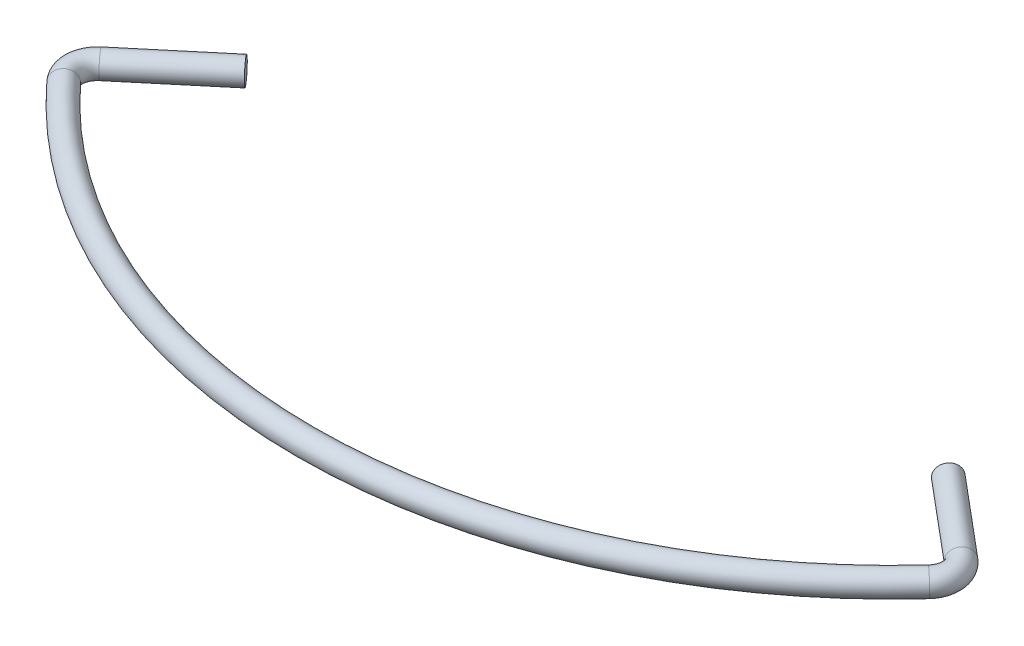
ISO-10303-21;
HEADER;
FILE_DESCRIPTION(('STEP AP214'),'2;1');
FILE_NAME('part.step','',(''),(''),'','','');
FILE_SCHEMA(('AUTOMOTIVE_DESIGN { 1 0 10303 214 1 1 1 1 }'));
ENDSEC;
DATA;
#1=APPLICATION_CONTEXT('core data for automotive mechanical design processes');
#2=APPLICATION_PROTOCOL_DEFINITION('international standard','automotive_design',2000,#1);
#3=PRODUCT_CONTEXT('',#1,'mechanical');
#4=PRODUCT('Part','Part','',(#3));
#5=PRODUCT_RELATED_PRODUCT_CATEGORY('part','',(#4));
#6=PRODUCT_DEFINITION_FORMATION('','',#4);
#7=PRODUCT_DEFINITION_CONTEXT('part definition',#1,'design');
#8=PRODUCT_DEFINITION('design','',#6,#7);
#9=PRODUCT_DEFINITION_SHAPE('','',#8);
#10=(LENGTH_UNIT() NAMED_UNIT(*) SI_UNIT(.MILLI.,.METRE.));
#11=(NAMED_UNIT(*) PLANE_ANGLE_UNIT() SI_UNIT($,.RADIAN.));
#12=(NAMED_UNIT(*) SI_UNIT($,.STERADIAN.) SOLID_ANGLE_UNIT());
#13=UNCERTAINTY_MEASURE_WITH_UNIT(LENGTH_MEASURE(1.E-05),#10,'distance_accuracy_value','');
#14=(GEOMETRIC_REPRESENTATION_CONTEXT(3) GLOBAL_UNCERTAINTY_ASSIGNED_CONTEXT((#13)) GLOBAL_UNIT_ASSIGNED_CONTEXT((#10,
#11,#12)) REPRESENTATION_CONTEXT('',''));
#15=CARTESIAN_POINT('',(0.,0.,0.));
#16=DIRECTION('',(0.,0.,1.));
#17=DIRECTION('',(1.,0.,0.));
#18=AXIS2_PLACEMENT_3D('',#15,#16,#17);
#19=CARTESIAN_POINT('',(517.079999105311,0.,433.881636538413));
#20=DIRECTION('',(0.766044443118981,0.,0.642787609686536));
#21=DIRECTION('',(0.642787609686536,0.,-0.766044443118981));
#22=AXIS2_PLACEMENT_3D('',#19,#20,#21);
#23=CYLINDRICAL_SURFACE('',#22,15.);
#24=CARTESIAN_POINT('',(539.572146309003,0.,452.754788961416));
#25=DIRECTION('',(0.76604444311898,0.,0.642787609686538));
#26=DIRECTION('',(0.642787609686538,0.,-0.76604444311898));
#27=AXIS2_PLACEMENT_3D('',#24,#25,#26);
#28=CIRCLE('',#27,15.);
#29=CARTESIAN_POINT('',(549.213960454303,0.,441.264122314629));
#30=VERTEX_POINT('',#29);
#31=EDGE_CURVE('E47',#30,#30,#28,.T.);
#32=ORIENTED_EDGE('',*,*,#31,.F.);
#33=EDGE_LOOP('',(#32));
#34=FACE_BOUND('',#33,.T.);
#35=CARTESIAN_POINT('',(440.475554793413,0.,369.602875569759));
#36=DIRECTION('',(0.76604444311898,0.,0.642787609686538));
#37=DIRECTION('',(0.642787609686538,0.,-0.76604444311898));
#38=AXIS2_PLACEMENT_3D('',#35,#36,#37);
#39=CIRCLE('',#38,15.);
#40=CARTESIAN_POINT('',(450.117368938711,0.,358.112208922975));
#41=VERTEX_POINT('',#40);
#42=EDGE_CURVE('E55',#41,#41,#39,.T.);
#43=ORIENTED_EDGE('',*,*,#42,.T.);
#44=EDGE_LOOP('',(#43));
#45=FACE_BOUND('',#44,.T.);
#46=ADVANCED_FACE('F32',(#34,#45),#23,.T.);
#47=CARTESIAN_POINT('',(520.288518018407,0.,475.736122254985));
#48=DIRECTION('',(0.,-1.,0.));
#49=DIRECTION('',(0.,0.,-1.));
#50=AXIS2_PLACEMENT_3D('',#47,#48,#49);
#51=TOROIDAL_SURFACE('',#50,30.0000000000023,15.);
#52=CARTESIAN_POINT('',(542.42845495536,0.,495.980212563708));
#53=DIRECTION('',(-0.674803010290764,0.,0.737997897898444));
#54=DIRECTION('',(0.737997897898444,0.,0.674803010290764));
#55=AXIS2_PLACEMENT_3D('',#52,#53,#54);
#56=CIRCLE('',#55,15.);
#57=CARTESIAN_POINT('',(553.498423423839,0.,506.102257718071));
#58=VERTEX_POINT('',#57);
#59=EDGE_CURVE('E43',#58,#58,#56,.T.);
#60=CARTESIAN_POINT('',(520.288518018407,0.,475.736122254985));
#61=DIRECTION('',(0.,-1.,0.));
#62=DIRECTION('',(0.,0.,-1.));
#63=AXIS2_PLACEMENT_3D('',#60,#61,#62);
#64=CIRCLE('',#63,45.0000000000023);
#65=EDGE_CURVE('',#30,#58,#64,.T.);
#66=ORIENTED_EDGE('',*,*,#31,.T.);
#67=ORIENTED_EDGE('',*,*,#59,.F.);
#68=ORIENTED_EDGE('',*,*,#65,.T.);
#69=ORIENTED_EDGE('',*,*,#65,.F.);
#70=EDGE_LOOP('',(#66,#68,#67,#69));
#71=FACE_BOUND('',#70,.T.);
#72=ADVANCED_FACE('F81',(#71),#51,.T.);
#73=CARTESIAN_POINT('',(0.,0.,0.));
#74=DIRECTION('',(0.,-1.,0.));
#75=DIRECTION('',(0.,0.,-1.));
#76=AXIS2_PLACEMENT_3D('',#73,#74,#75);
#77=TOROIDAL_SURFACE('',#76,735.000000000001,15.);
#78=CARTESIAN_POINT('',(-542.428454955361,0.,495.980212563708));
#79=DIRECTION('',(-0.674803010290757,0.,-0.737997897898451));
#80=DIRECTION('',(-0.737997897898451,0.,0.674803010290757));
#81=AXIS2_PLACEMENT_3D('',#78,#79,#80);
#82=CIRCLE('',#81,15.);
#83=CARTESIAN_POINT('',(-553.498423423837,0.,506.10225771807));
#84=VERTEX_POINT('',#83);
#85=EDGE_CURVE('E39',#84,#84,#82,.T.);
#86=CARTESIAN_POINT('',(0.,0.,0.));
#87=DIRECTION('',(0.,-1.,0.));
#88=DIRECTION('',(0.,0.,-1.));
#89=AXIS2_PLACEMENT_3D('',#86,#87,#88);
#90=CIRCLE('',#89,750.000000000001);
#91=EDGE_CURVE('',#58,#84,#90,.T.);
#92=ORIENTED_EDGE('',*,*,#59,.T.);
#93=ORIENTED_EDGE('',*,*,#85,.F.);
#94=ORIENTED_EDGE('',*,*,#91,.T.);
#95=ORIENTED_EDGE('',*,*,#91,.F.);
#96=EDGE_LOOP('',(#92,#94,#93,#95));
#97=FACE_BOUND('',#96,.T.);
#98=ADVANCED_FACE('F74',(#97),#77,.T.);
#99=CARTESIAN_POINT('',(-520.288518018407,0.,475.736122254985));
#100=DIRECTION('',(0.,-1.,0.));
#101=DIRECTION('',(0.,0.,-1.));
#102=AXIS2_PLACEMENT_3D('',#99,#100,#101);
#103=TOROIDAL_SURFACE('',#102,30.0000000000003,15.);
#104=CARTESIAN_POINT('',(-539.572146309003,0.,452.754788961416));
#105=DIRECTION('',(0.766044443118981,0.,-0.642787609686535));
#106=DIRECTION('',(-0.642787609686535,0.,-0.766044443118981));
#107=AXIS2_PLACEMENT_3D('',#104,#105,#106);
#108=CIRCLE('',#107,15.);
#109=CARTESIAN_POINT('',(-549.213960454301,0.,441.264122314631));
#110=VERTEX_POINT('',#109);
#111=EDGE_CURVE('E10',#110,#110,#108,.T.);
#112=CARTESIAN_POINT('',(-520.288518018407,0.,475.736122254985));
#113=DIRECTION('',(0.,-1.,0.));
#114=DIRECTION('',(0.,0.,-1.));
#115=AXIS2_PLACEMENT_3D('',#112,#113,#114);
#116=CIRCLE('',#115,45.0000000000003);
#117=EDGE_CURVE('',#84,#110,#116,.T.);
#118=ORIENTED_EDGE('',*,*,#85,.T.);
#119=ORIENTED_EDGE('',*,*,#111,.F.);
#120=ORIENTED_EDGE('',*,*,#117,.T.);
#121=ORIENTED_EDGE('',*,*,#117,.F.);
#122=EDGE_LOOP('',(#118,#120,#119,#121));
#123=FACE_BOUND('',#122,.T.);
#124=ADVANCED_FACE('F70',(#123),#103,.T.);
#125=CARTESIAN_POINT('',(-539.572146309003,0.,452.754788961416));
#126=DIRECTION('',(0.766044443118979,0.,-0.642787609686539));
#127=DIRECTION('',(-0.642787609686539,0.,-0.766044443118979));
#128=AXIS2_PLACEMENT_3D('',#125,#126,#127);
#129=CYLINDRICAL_SURFACE('',#128,15.);
#130=ORIENTED_EDGE('',*,*,#111,.T.);
#131=EDGE_LOOP('',(#130));
#132=FACE_BOUND('',#131,.T.);
#133=CARTESIAN_POINT('',(-440.475554793413,0.,369.602875569759));
#134=DIRECTION('',(0.76604444311898,0.,-0.642787609686537));
#135=DIRECTION('',(-0.642787609686537,0.,-0.76604444311898));
#136=AXIS2_PLACEMENT_3D('',#133,#134,#135);
#137=CIRCLE('',#136,14.9999999999978);
#138=CARTESIAN_POINT('',(-450.117368938709,0.,358.112208922976));
#139=VERTEX_POINT('',#138);
#140=EDGE_CURVE('E52',#139,#139,#137,.T.);
#141=ORIENTED_EDGE('',*,*,#140,.F.);
#142=EDGE_LOOP('',(#141));
#143=FACE_BOUND('',#142,.T.);
#144=ADVANCED_FACE('F34',(#132,#143),#129,.T.);
#145=CARTESIAN_POINT('',(-440.475554793413,0.,369.602875569759));
#146=DIRECTION('',(0.76604444311898,0.,-0.642787609686537));
#147=DIRECTION('',(-0.642787609686537,0.,-0.76604444311898));
#148=AXIS2_PLACEMENT_3D('',#145,#146,#147);
#149=PLANE('',#148);
#150=ORIENTED_EDGE('',*,*,#140,.T.);
#151=EDGE_LOOP('',(#150));
#152=FACE_BOUND('',#151,.T.);
#153=ADVANCED_FACE('F62',(#152),#149,.T.);
#154=CARTESIAN_POINT('',(440.475554793413,0.,369.602875569759));
#155=DIRECTION('',(0.76604444311898,0.,0.642787609686538));
#156=DIRECTION('',(0.642787609686538,0.,-0.76604444311898));
#157=AXIS2_PLACEMENT_3D('',#154,#155,#156);
#158=PLANE('',#157);
#159=ORIENTED_EDGE('',*,*,#42,.F.);
#160=EDGE_LOOP('',(#159));
#161=FACE_BOUND('',#160,.T.);
#162=ADVANCED_FACE('F60',(#161),#158,.F.);
#163=CLOSED_SHELL('',(#46,#72,#98,#124,#144,#153,#162));
#164=MANIFOLD_SOLID_BREP('B2',#163);
#165=ADVANCED_BREP_SHAPE_REPRESENTATION('',(#18,#164),#14);
#166=SHAPE_DEFINITION_REPRESENTATION(#9,#165);
ENDSEC;
END-ISO-10303-21;
